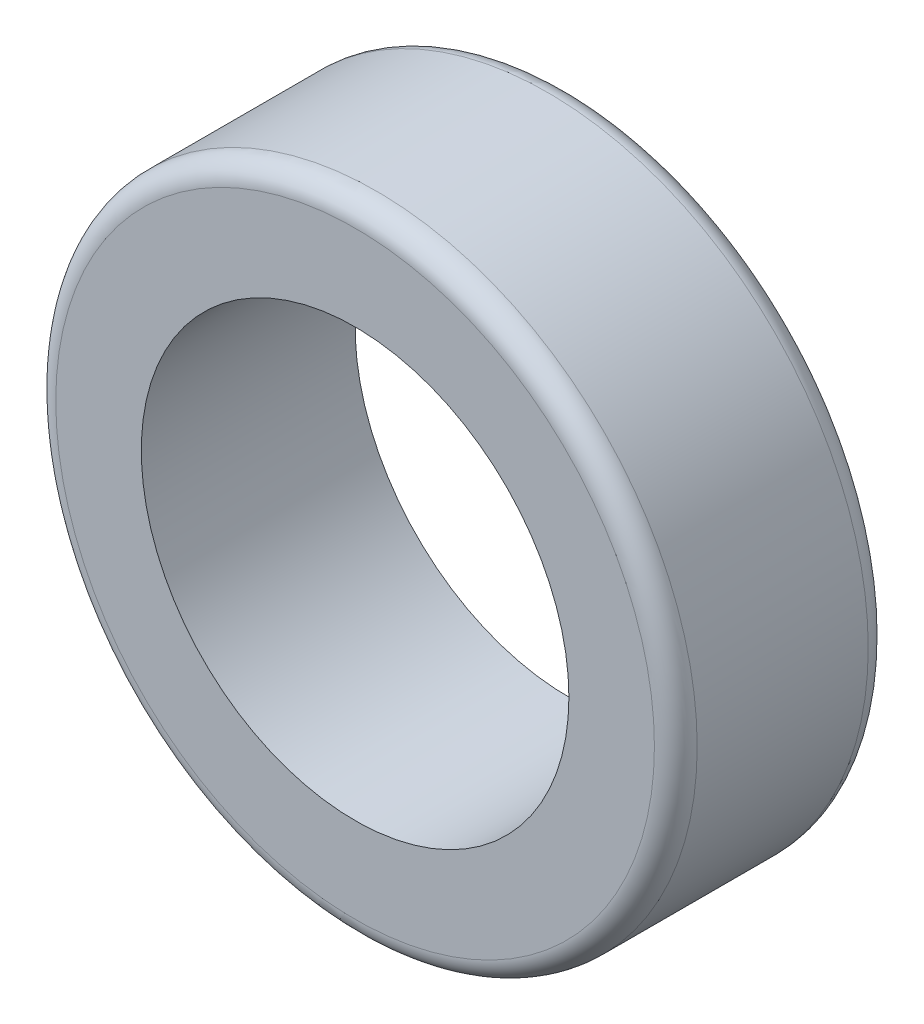
ISO-10303-21;
HEADER;
FILE_DESCRIPTION(('STEP AP214'),'2;1');
FILE_NAME('part.step','',(''),(''),'','','');
FILE_SCHEMA(('AUTOMOTIVE_DESIGN { 1 0 10303 214 1 1 1 1 }'));
ENDSEC;
DATA;
#1=APPLICATION_CONTEXT('core data for automotive mechanical design processes');
#2=APPLICATION_PROTOCOL_DEFINITION('international standard','automotive_design',2000,#1);
#3=PRODUCT_CONTEXT('',#1,'mechanical');
#4=PRODUCT('Part','Part','',(#3));
#5=PRODUCT_RELATED_PRODUCT_CATEGORY('part','',(#4));
#6=PRODUCT_DEFINITION_FORMATION('','',#4);
#7=PRODUCT_DEFINITION_CONTEXT('part definition',#1,'design');
#8=PRODUCT_DEFINITION('design','',#6,#7);
#9=PRODUCT_DEFINITION_SHAPE('','',#8);
#10=(LENGTH_UNIT() NAMED_UNIT(*) SI_UNIT(.MILLI.,.METRE.));
#11=(NAMED_UNIT(*) PLANE_ANGLE_UNIT() SI_UNIT($,.RADIAN.));
#12=(NAMED_UNIT(*) SI_UNIT($,.STERADIAN.) SOLID_ANGLE_UNIT());
#13=UNCERTAINTY_MEASURE_WITH_UNIT(LENGTH_MEASURE(1.E-05),#10,'distance_accuracy_value','');
#14=(GEOMETRIC_REPRESENTATION_CONTEXT(3) GLOBAL_UNCERTAINTY_ASSIGNED_CONTEXT((#13)) GLOBAL_UNIT_ASSIGNED_CONTEXT((#10,
#11,#12)) REPRESENTATION_CONTEXT('',''));
#15=CARTESIAN_POINT('',(0.,0.,0.));
#16=DIRECTION('',(0.,0.,1.));
#17=DIRECTION('',(1.,0.,0.));
#18=AXIS2_PLACEMENT_3D('',#15,#16,#17);
#19=CARTESIAN_POINT('',(0.,0.,1.));
#20=DIRECTION('',(0.,0.,1.));
#21=DIRECTION('',(1.,0.,0.));
#22=AXIS2_PLACEMENT_3D('',#19,#20,#21);
#23=PLANE('',#22);
#24=CARTESIAN_POINT('',(0.,0.,1.));
#25=DIRECTION('',(0.,0.,1.));
#26=DIRECTION('',(1.,0.,0.));
#27=AXIS2_PLACEMENT_3D('',#24,#25,#26);
#28=CIRCLE('',#27,1.4);
#29=CARTESIAN_POINT('',(1.4,0.,1.));
#30=VERTEX_POINT('',#29);
#31=EDGE_CURVE('E10',#30,#30,#28,.T.);
#32=ORIENTED_EDGE('',*,*,#31,.T.);
#33=EDGE_LOOP('',(#32));
#34=FACE_BOUND('',#33,.T.);
#35=CARTESIAN_POINT('',(0.,0.,1.));
#36=DIRECTION('',(0.,0.,1.));
#37=DIRECTION('',(1.,0.,0.));
#38=AXIS2_PLACEMENT_3D('',#35,#36,#37);
#39=CIRCLE('',#38,1.);
#40=CARTESIAN_POINT('',(1.,0.,1.));
#41=VERTEX_POINT('',#40);
#42=EDGE_CURVE('E52',#41,#41,#39,.T.);
#43=ORIENTED_EDGE('',*,*,#42,.F.);
#44=EDGE_LOOP('',(#43));
#45=FACE_BOUND('',#44,.T.);
#46=ADVANCED_FACE('F32',(#34,#45),#23,.T.);
#47=CARTESIAN_POINT('',(0.,0.,0.));
#48=DIRECTION('',(0.,0.,1.));
#49=DIRECTION('',(1.,0.,0.));
#50=AXIS2_PLACEMENT_3D('',#47,#48,#49);
#51=PLANE('',#50);
#52=CARTESIAN_POINT('',(0.,0.,0.));
#53=DIRECTION('',(0.,0.,1.));
#54=DIRECTION('',(1.,0.,0.));
#55=AXIS2_PLACEMENT_3D('',#52,#53,#54);
#56=CIRCLE('',#55,1.4);
#57=CARTESIAN_POINT('',(1.4,0.,0.));
#58=VERTEX_POINT('',#57);
#59=EDGE_CURVE('E39',#58,#58,#56,.F.);
#60=ORIENTED_EDGE('',*,*,#59,.T.);
#61=EDGE_LOOP('',(#60));
#62=FACE_BOUND('',#61,.T.);
#63=CARTESIAN_POINT('',(0.,0.,0.));
#64=DIRECTION('',(0.,0.,1.));
#65=DIRECTION('',(1.,0.,0.));
#66=AXIS2_PLACEMENT_3D('',#63,#64,#65);
#67=CIRCLE('',#66,1.);
#68=CARTESIAN_POINT('',(1.,0.,0.));
#69=VERTEX_POINT('',#68);
#70=EDGE_CURVE('E53',#69,#69,#67,.T.);
#71=ORIENTED_EDGE('',*,*,#70,.T.);
#72=EDGE_LOOP('',(#71));
#73=FACE_BOUND('',#72,.T.);
#74=ADVANCED_FACE('F63',(#62,#73),#51,.F.);
#75=CARTESIAN_POINT('',(0.,0.,1.));
#76=DIRECTION('',(0.,0.,-1.));
#77=DIRECTION('',(-1.,0.,0.));
#78=AXIS2_PLACEMENT_3D('',#75,#76,#77);
#79=CYLINDRICAL_SURFACE('',#78,1.5);
#80=CARTESIAN_POINT('',(0.,0.,0.1));
#81=DIRECTION('',(0.,0.,1.));
#82=DIRECTION('',(1.,0.,0.));
#83=AXIS2_PLACEMENT_3D('',#80,#81,#82);
#84=CIRCLE('',#83,1.5);
#85=CARTESIAN_POINT('',(1.5,0.,0.1));
#86=VERTEX_POINT('',#85);
#87=EDGE_CURVE('E43',#86,#86,#84,.T.);
#88=ORIENTED_EDGE('',*,*,#87,.T.);
#89=EDGE_LOOP('',(#88));
#90=FACE_BOUND('',#89,.T.);
#91=CARTESIAN_POINT('',(0.,0.,0.9));
#92=DIRECTION('',(0.,0.,1.));
#93=DIRECTION('',(1.,0.,0.));
#94=AXIS2_PLACEMENT_3D('',#91,#92,#93);
#95=CIRCLE('',#94,1.5);
#96=CARTESIAN_POINT('',(1.5,0.,0.9));
#97=VERTEX_POINT('',#96);
#98=EDGE_CURVE('E47',#97,#97,#95,.F.);
#99=ORIENTED_EDGE('',*,*,#98,.T.);
#100=EDGE_LOOP('',(#99));
#101=FACE_BOUND('',#100,.T.);
#102=ADVANCED_FACE('F69',(#90,#101),#79,.T.);
#103=CARTESIAN_POINT('',(0.,0.,1.));
#104=DIRECTION('',(0.,0.,-1.));
#105=DIRECTION('',(-1.,0.,0.));
#106=AXIS2_PLACEMENT_3D('',#103,#104,#105);
#107=CYLINDRICAL_SURFACE('',#106,1.);
#108=ORIENTED_EDGE('',*,*,#42,.T.);
#109=EDGE_LOOP('',(#108));
#110=FACE_BOUND('',#109,.T.);
#111=ORIENTED_EDGE('',*,*,#70,.F.);
#112=EDGE_LOOP('',(#111));
#113=FACE_BOUND('',#112,.T.);
#114=ADVANCED_FACE('F59',(#110,#113),#107,.F.);
#115=CARTESIAN_POINT('',(0.,0.,0.1));
#116=DIRECTION('',(0.,0.,1.));
#117=DIRECTION('',(1.,0.,0.));
#118=AXIS2_PLACEMENT_3D('',#115,#116,#117);
#119=TOROIDAL_SURFACE('',#118,1.4,0.1);
#120=ORIENTED_EDGE('',*,*,#59,.F.);
#121=EDGE_LOOP('',(#120));
#122=FACE_BOUND('',#121,.T.);
#123=ORIENTED_EDGE('',*,*,#87,.F.);
#124=EDGE_LOOP('',(#123));
#125=FACE_BOUND('',#124,.T.);
#126=ADVANCED_FACE('F75',(#122,#125),#119,.T.);
#127=CARTESIAN_POINT('',(0.,0.,0.9));
#128=DIRECTION('',(0.,0.,1.));
#129=DIRECTION('',(1.,0.,0.));
#130=AXIS2_PLACEMENT_3D('',#127,#128,#129);
#131=TOROIDAL_SURFACE('',#130,1.4,0.1);
#132=ORIENTED_EDGE('',*,*,#98,.F.);
#133=EDGE_LOOP('',(#132));
#134=FACE_BOUND('',#133,.T.);
#135=ORIENTED_EDGE('',*,*,#31,.F.);
#136=EDGE_LOOP('',(#135));
#137=FACE_BOUND('',#136,.T.);
#138=ADVANCED_FACE('F34',(#134,#137),#131,.T.);
#139=CLOSED_SHELL('',(#46,#74,#102,#114,#126,#138));
#140=MANIFOLD_SOLID_BREP('B2',#139);
#141=ADVANCED_BREP_SHAPE_REPRESENTATION('',(#18,#140),#14);
#142=SHAPE_DEFINITION_REPRESENTATION(#9,#141);
ENDSEC;
END-ISO-10303-21;
